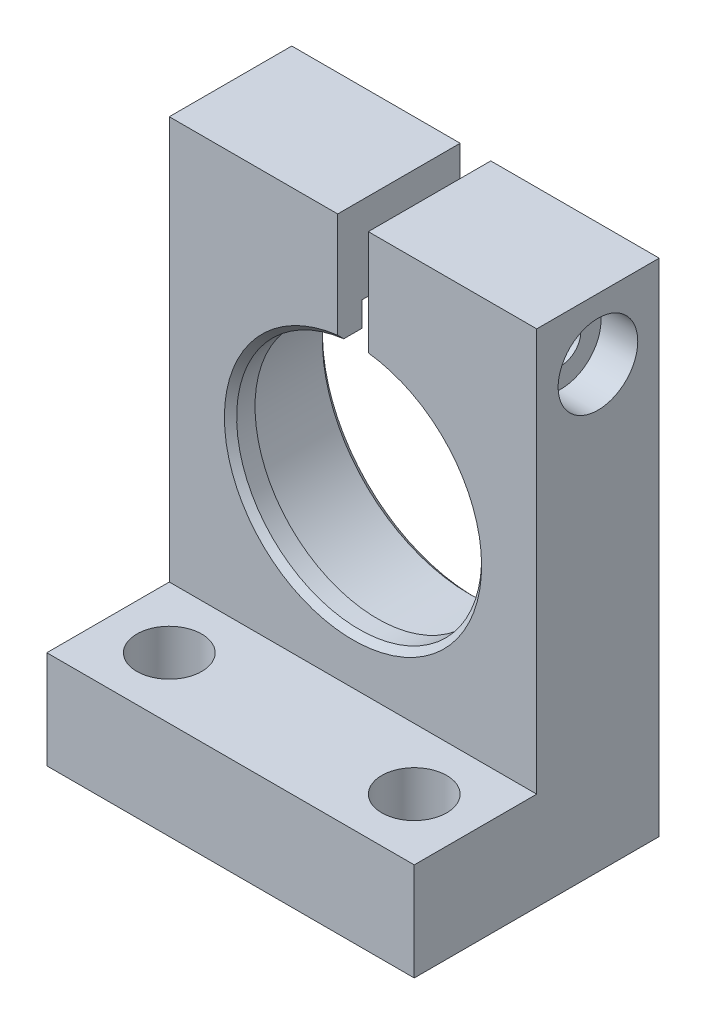
ISO-10303-21;
HEADER;
FILE_DESCRIPTION(('STEP AP214'),'2;1');
FILE_NAME('part.step','',(''),(''),'','','');
FILE_SCHEMA(('AUTOMOTIVE_DESIGN { 1 0 10303 214 1 1 1 1 }'));
ENDSEC;
DATA;
#1=APPLICATION_CONTEXT('core data for automotive mechanical design processes');
#2=APPLICATION_PROTOCOL_DEFINITION('international standard','automotive_design',2000,#1);
#3=PRODUCT_CONTEXT('',#1,'mechanical');
#4=PRODUCT('Part','Part','',(#3));
#5=PRODUCT_RELATED_PRODUCT_CATEGORY('part','',(#4));
#6=PRODUCT_DEFINITION_FORMATION('','',#4);
#7=PRODUCT_DEFINITION_CONTEXT('part definition',#1,'design');
#8=PRODUCT_DEFINITION('design','',#6,#7);
#9=PRODUCT_DEFINITION_SHAPE('','',#8);
#10=(LENGTH_UNIT() NAMED_UNIT(*) SI_UNIT(.MILLI.,.METRE.));
#11=(NAMED_UNIT(*) PLANE_ANGLE_UNIT() SI_UNIT($,.RADIAN.));
#12=(NAMED_UNIT(*) SI_UNIT($,.STERADIAN.) SOLID_ANGLE_UNIT());
#13=UNCERTAINTY_MEASURE_WITH_UNIT(LENGTH_MEASURE(1.E-05),#10,'distance_accuracy_value','');
#14=(GEOMETRIC_REPRESENTATION_CONTEXT(3) GLOBAL_UNCERTAINTY_ASSIGNED_CONTEXT((#13)) GLOBAL_UNIT_ASSIGNED_CONTEXT((#10,
#11,#12)) REPRESENTATION_CONTEXT('',''));
#15=CARTESIAN_POINT('',(0.,0.,0.));
#16=DIRECTION('',(0.,0.,1.));
#17=DIRECTION('',(1.,0.,0.));
#18=AXIS2_PLACEMENT_3D('',#15,#16,#17);
#19=CARTESIAN_POINT('',(0.,0.,10.));
#20=DIRECTION('',(0.,0.,1.));
#21=DIRECTION('',(1.,0.,0.));
#22=AXIS2_PLACEMENT_3D('',#19,#20,#21);
#23=PLANE('',#22);
#24=DIRECTION('',(0.,-1.,0.));
#25=VECTOR('',#24,1.);
#26=CARTESIAN_POINT('',(-15.,-21.9,10.));
#27=LINE('',#26,#25);
#28=CARTESIAN_POINT('',(-15.,19.,10.));
#29=VERTEX_POINT('',#28);
#30=CARTESIAN_POINT('',(-15.,-13.9,10.));
#31=VERTEX_POINT('',#30);
#32=EDGE_CURVE('E158',#29,#31,#27,.T.);
#33=ORIENTED_EDGE('',*,*,#32,.T.);
#34=DIRECTION('',(1.,0.,0.));
#35=VECTOR('',#34,1.);
#36=CARTESIAN_POINT('',(-15.,-13.9,10.));
#37=LINE('',#36,#35);
#38=CARTESIAN_POINT('',(15.,-13.9,10.));
#39=VERTEX_POINT('',#38);
#40=EDGE_CURVE('E143',#31,#39,#37,.T.);
#41=ORIENTED_EDGE('',*,*,#40,.T.);
#42=DIRECTION('',(0.,1.,0.));
#43=VECTOR('',#42,1.);
#44=CARTESIAN_POINT('',(15.,-21.9,10.));
#45=LINE('',#44,#43);
#46=CARTESIAN_POINT('',(15.,19.,10.));
#47=VERTEX_POINT('',#46);
#48=EDGE_CURVE('E169',#39,#47,#45,.T.);
#49=ORIENTED_EDGE('',*,*,#48,.T.);
#50=DIRECTION('',(-1.,0.,0.));
#51=VECTOR('',#50,1.);
#52=CARTESIAN_POINT('',(15.,19.,10.));
#53=LINE('',#52,#51);
#54=CARTESIAN_POINT('',(1.25,19.,10.));
#55=VERTEX_POINT('',#54);
#56=EDGE_CURVE('E182',#47,#55,#53,.T.);
#57=ORIENTED_EDGE('',*,*,#56,.T.);
#58=DIRECTION('',(0.,1.,0.));
#59=VECTOR('',#58,1.);
#60=CARTESIAN_POINT('',(1.25,9.92156741649221,10.));
#61=LINE('',#60,#59);
#62=CARTESIAN_POINT('',(1.25,10.4253297309965,10.));
#63=VERTEX_POINT('',#62);
#64=EDGE_CURVE('E341',#63,#55,#61,.T.);
#65=ORIENTED_EDGE('',*,*,#64,.F.);
#66=CARTESIAN_POINT('',(0.,0.,10.));
#67=DIRECTION('',(0.,0.,1.));
#68=DIRECTION('',(1.,0.,0.));
#69=AXIS2_PLACEMENT_3D('',#66,#67,#68);
#70=CIRCLE('',#69,10.5);
#71=CARTESIAN_POINT('',(-1.25,10.4253297309965,10.));
#72=VERTEX_POINT('',#71);
#73=EDGE_CURVE('E52',#63,#72,#70,.F.);
#74=ORIENTED_EDGE('',*,*,#73,.T.);
#75=DIRECTION('',(0.,-1.,0.));
#76=VECTOR('',#75,1.);
#77=CARTESIAN_POINT('',(-1.25,9.92156741649221,10.));
#78=LINE('',#77,#76);
#79=CARTESIAN_POINT('',(-1.25,19.,10.));
#80=VERTEX_POINT('',#79);
#81=EDGE_CURVE('E345',#80,#72,#78,.T.);
#82=ORIENTED_EDGE('',*,*,#81,.F.);
#83=EDGE_CURVE('E166',#80,#29,#53,.T.);
#84=ORIENTED_EDGE('',*,*,#83,.T.);
#85=EDGE_LOOP('',(#33,#41,#49,#57,#65,#74,#82,#84));
#86=FACE_BOUND('',#85,.T.);
#87=ADVANCED_FACE('F41',(#86),#23,.T.);
#88=CARTESIAN_POINT('',(15.,-21.9,10.));
#89=DIRECTION('',(-1.,0.,0.));
#90=DIRECTION('',(0.,0.,1.));
#91=AXIS2_PLACEMENT_3D('',#88,#89,#90);
#92=PLANE('',#91);
#93=DIRECTION('',(0.,1.,0.));
#94=VECTOR('',#93,1.);
#95=CARTESIAN_POINT('',(15.,-21.9,0.));
#96=LINE('',#95,#94);
#97=CARTESIAN_POINT('',(15.,-21.9,0.));
#98=VERTEX_POINT('',#97);
#99=CARTESIAN_POINT('',(15.,19.,0.));
#100=VERTEX_POINT('',#99);
#101=EDGE_CURVE('E193',#98,#100,#96,.T.);
#102=ORIENTED_EDGE('',*,*,#101,.T.);
#103=DIRECTION('',(0.,0.,-1.));
#104=VECTOR('',#103,1.);
#105=CARTESIAN_POINT('',(15.,19.,10.));
#106=LINE('',#105,#104);
#107=EDGE_CURVE('E198',#47,#100,#106,.T.);
#108=ORIENTED_EDGE('',*,*,#107,.F.);
#109=ORIENTED_EDGE('',*,*,#48,.F.);
#110=DIRECTION('',(0.,0.,1.));
#111=VECTOR('',#110,1.);
#112=CARTESIAN_POINT('',(15.,-13.9,10.));
#113=LINE('',#112,#111);
#114=CARTESIAN_POINT('',(15.,-13.9,20.));
#115=VERTEX_POINT('',#114);
#116=EDGE_CURVE('E59',#39,#115,#113,.T.);
#117=ORIENTED_EDGE('',*,*,#116,.T.);
#118=DIRECTION('',(0.,-1.,0.));
#119=VECTOR('',#118,1.);
#120=CARTESIAN_POINT('',(15.,-13.9,20.));
#121=LINE('',#120,#119);
#122=CARTESIAN_POINT('',(15.,-21.9,20.));
#123=VERTEX_POINT('',#122);
#124=EDGE_CURVE('E377',#115,#123,#121,.T.);
#125=ORIENTED_EDGE('',*,*,#124,.T.);
#126=DIRECTION('',(0.,0.,-1.));
#127=VECTOR('',#126,1.);
#128=CARTESIAN_POINT('',(15.,-21.9,10.));
#129=LINE('',#128,#127);
#130=EDGE_CURVE('E202',#123,#98,#129,.T.);
#131=ORIENTED_EDGE('',*,*,#130,.T.);
#132=EDGE_LOOP('',(#102,#108,#109,#117,#125,#131));
#133=FACE_BOUND('',#132,.T.);
#134=CARTESIAN_POINT('',(15.,14.,5.));
#135=DIRECTION('',(1.,0.,0.));
#136=DIRECTION('',(0.,0.,-1.));
#137=AXIS2_PLACEMENT_3D('',#134,#135,#136);
#138=CIRCLE('',#137,3.25);
#139=CARTESIAN_POINT('',(15.,14.,1.75));
#140=VERTEX_POINT('',#139);
#141=EDGE_CURVE('E365',#140,#140,#138,.T.);
#142=ORIENTED_EDGE('',*,*,#141,.F.);
#143=EDGE_LOOP('',(#142));
#144=FACE_BOUND('',#143,.T.);
#145=ADVANCED_FACE('F287',(#133,#144),#92,.F.);
#146=CARTESIAN_POINT('',(15.,19.,10.));
#147=DIRECTION('',(0.,-1.,0.));
#148=DIRECTION('',(1.,0.,0.));
#149=AXIS2_PLACEMENT_3D('',#146,#147,#148);
#150=PLANE('',#149);
#151=ORIENTED_EDGE('',*,*,#83,.F.);
#152=DIRECTION('',(0.,0.,1.));
#153=VECTOR('',#152,1.);
#154=CARTESIAN_POINT('',(-1.25,19.,0.));
#155=LINE('',#154,#153);
#156=CARTESIAN_POINT('',(-1.25,19.,0.));
#157=VERTEX_POINT('',#156);
#158=EDGE_CURVE('E333',#157,#80,#155,.T.);
#159=ORIENTED_EDGE('',*,*,#158,.F.);
#160=DIRECTION('',(-1.,0.,0.));
#161=VECTOR('',#160,1.);
#162=CARTESIAN_POINT('',(15.,19.,0.));
#163=LINE('',#162,#161);
#164=CARTESIAN_POINT('',(-15.,19.,0.));
#165=VERTEX_POINT('',#164);
#166=EDGE_CURVE('E176',#157,#165,#163,.T.);
#167=ORIENTED_EDGE('',*,*,#166,.T.);
#168=DIRECTION('',(0.,0.,-1.));
#169=VECTOR('',#168,1.);
#170=CARTESIAN_POINT('',(-15.,19.,10.));
#171=LINE('',#170,#169);
#172=EDGE_CURVE('E186',#29,#165,#171,.T.);
#173=ORIENTED_EDGE('',*,*,#172,.F.);
#174=EDGE_LOOP('',(#151,#159,#167,#173));
#175=FACE_BOUND('',#174,.T.);
#176=ADVANCED_FACE('F290',(#175),#150,.F.);
#177=CARTESIAN_POINT('',(0.,0.,0.));
#178=DIRECTION('',(0.,0.,1.));
#179=DIRECTION('',(1.,0.,0.));
#180=AXIS2_PLACEMENT_3D('',#177,#178,#179);
#181=PLANE('',#180);
#182=DIRECTION('',(0.,-1.,0.));
#183=VECTOR('',#182,1.);
#184=CARTESIAN_POINT('',(-1.25,9.92156741649221,0.));
#185=LINE('',#184,#183);
#186=CARTESIAN_POINT('',(-1.25,12.4373429638328,0.));
#187=VERTEX_POINT('',#186);
#188=EDGE_CURVE('E344',#157,#187,#185,.T.);
#189=ORIENTED_EDGE('',*,*,#188,.T.);
#190=CARTESIAN_POINT('',(0.,0.,0.));
#191=DIRECTION('',(0.,0.,1.));
#192=DIRECTION('',(1.,0.,0.));
#193=AXIS2_PLACEMENT_3D('',#190,#191,#192);
#194=CIRCLE('',#193,12.5);
#195=CARTESIAN_POINT('',(1.25,12.4373429638328,0.));
#196=VERTEX_POINT('',#195);
#197=EDGE_CURVE('E221',#187,#196,#194,.T.);
#198=ORIENTED_EDGE('',*,*,#197,.T.);
#199=DIRECTION('',(0.,1.,0.));
#200=VECTOR('',#199,1.);
#201=CARTESIAN_POINT('',(1.25,9.92156741649221,0.));
#202=LINE('',#201,#200);
#203=CARTESIAN_POINT('',(1.25,19.,0.));
#204=VERTEX_POINT('',#203);
#205=EDGE_CURVE('E338',#196,#204,#202,.T.);
#206=ORIENTED_EDGE('',*,*,#205,.T.);
#207=EDGE_CURVE('E170',#100,#204,#163,.T.);
#208=ORIENTED_EDGE('',*,*,#207,.F.);
#209=ORIENTED_EDGE('',*,*,#101,.F.);
#210=DIRECTION('',(1.,0.,0.));
#211=VECTOR('',#210,1.);
#212=CARTESIAN_POINT('',(15.,-21.9,0.));
#213=LINE('',#212,#211);
#214=CARTESIAN_POINT('',(-15.,-21.9,0.));
#215=VERTEX_POINT('',#214);
#216=EDGE_CURVE('E190',#215,#98,#213,.T.);
#217=ORIENTED_EDGE('',*,*,#216,.F.);
#218=DIRECTION('',(0.,-1.,0.));
#219=VECTOR('',#218,1.);
#220=CARTESIAN_POINT('',(-15.,-21.9,0.));
#221=LINE('',#220,#219);
#222=EDGE_CURVE('E187',#165,#215,#221,.T.);
#223=ORIENTED_EDGE('',*,*,#222,.F.);
#224=ORIENTED_EDGE('',*,*,#166,.F.);
#225=EDGE_LOOP('',(#189,#198,#206,#208,#209,#217,#223,#224));
#226=FACE_BOUND('',#225,.T.);
#227=ADVANCED_FACE('F281',(#226),#181,.F.);
#228=CARTESIAN_POINT('',(-15.,-21.9,10.));
#229=DIRECTION('',(1.,0.,0.));
#230=DIRECTION('',(0.,0.,-1.));
#231=AXIS2_PLACEMENT_3D('',#228,#229,#230);
#232=PLANE('',#231);
#233=CARTESIAN_POINT('',(-15.,14.,5.));
#234=DIRECTION('',(-1.,0.,0.));
#235=DIRECTION('',(0.,0.,1.));
#236=AXIS2_PLACEMENT_3D('',#233,#234,#235);
#237=CIRCLE('',#236,1.25);
#238=CARTESIAN_POINT('',(-15.,14.,6.25));
#239=VERTEX_POINT('',#238);
#240=EDGE_CURVE('E373',#239,#239,#237,.T.);
#241=ORIENTED_EDGE('',*,*,#240,.F.);
#242=EDGE_LOOP('',(#241));
#243=FACE_BOUND('',#242,.T.);
#244=ORIENTED_EDGE('',*,*,#222,.T.);
#245=DIRECTION('',(0.,0.,-1.));
#246=VECTOR('',#245,1.);
#247=CARTESIAN_POINT('',(-15.,-21.9,10.));
#248=LINE('',#247,#246);
#249=CARTESIAN_POINT('',(-15.,-21.9,20.));
#250=VERTEX_POINT('',#249);
#251=EDGE_CURVE('E206',#250,#215,#248,.T.);
#252=ORIENTED_EDGE('',*,*,#251,.F.);
#253=DIRECTION('',(0.,-1.,0.));
#254=VECTOR('',#253,1.);
#255=CARTESIAN_POINT('',(-15.,-13.9,20.));
#256=LINE('',#255,#254);
#257=CARTESIAN_POINT('',(-15.,-13.9,20.));
#258=VERTEX_POINT('',#257);
#259=EDGE_CURVE('E160',#258,#250,#256,.T.);
#260=ORIENTED_EDGE('',*,*,#259,.F.);
#261=DIRECTION('',(0.,0.,-1.));
#262=VECTOR('',#261,1.);
#263=CARTESIAN_POINT('',(-15.,-13.9,10.));
#264=LINE('',#263,#262);
#265=EDGE_CURVE('E146',#258,#31,#264,.T.);
#266=ORIENTED_EDGE('',*,*,#265,.T.);
#267=ORIENTED_EDGE('',*,*,#32,.F.);
#268=ORIENTED_EDGE('',*,*,#172,.T.);
#269=EDGE_LOOP('',(#244,#252,#260,#266,#267,#268));
#270=FACE_BOUND('',#269,.T.);
#271=ADVANCED_FACE('F156',(#243,#270),#232,.F.);
#272=CARTESIAN_POINT('',(15.,-21.9,10.));
#273=DIRECTION('',(0.,1.,0.));
#274=DIRECTION('',(-1.,0.,0.));
#275=AXIS2_PLACEMENT_3D('',#272,#273,#274);
#276=PLANE('',#275);
#277=CARTESIAN_POINT('',(-10.,-21.9,15.));
#278=DIRECTION('',(0.,1.,0.));
#279=DIRECTION('',(-1.,0.,0.));
#280=AXIS2_PLACEMENT_3D('',#277,#278,#279);
#281=CIRCLE('',#280,2.65);
#282=CARTESIAN_POINT('',(-12.65,-21.9,15.));
#283=VERTEX_POINT('',#282);
#284=EDGE_CURVE('E399',#283,#283,#281,.T.);
#285=ORIENTED_EDGE('',*,*,#284,.T.);
#286=EDGE_LOOP('',(#285));
#287=FACE_BOUND('',#286,.T.);
#288=CARTESIAN_POINT('',(10.,-21.9,15.));
#289=DIRECTION('',(0.,1.,0.));
#290=DIRECTION('',(-1.,0.,0.));
#291=AXIS2_PLACEMENT_3D('',#288,#289,#290);
#292=CIRCLE('',#291,2.65);
#293=CARTESIAN_POINT('',(7.35,-21.9,15.));
#294=VERTEX_POINT('',#293);
#295=EDGE_CURVE('E387',#294,#294,#292,.T.);
#296=ORIENTED_EDGE('',*,*,#295,.T.);
#297=EDGE_LOOP('',(#296));
#298=FACE_BOUND('',#297,.T.);
#299=ORIENTED_EDGE('',*,*,#216,.T.);
#300=ORIENTED_EDGE('',*,*,#130,.F.);
#301=DIRECTION('',(-1.,0.,0.));
#302=VECTOR('',#301,1.);
#303=CARTESIAN_POINT('',(-15.,-21.9,20.));
#304=LINE('',#303,#302);
#305=EDGE_CURVE('E162',#123,#250,#304,.T.);
#306=ORIENTED_EDGE('',*,*,#305,.T.);
#307=ORIENTED_EDGE('',*,*,#251,.T.);
#308=EDGE_LOOP('',(#299,#300,#306,#307));
#309=FACE_BOUND('',#308,.T.);
#310=ADVANCED_FACE('F280',(#287,#298,#309),#276,.F.);
#311=ORIENTED_EDGE('',*,*,#207,.T.);
#312=DIRECTION('',(0.,0.,1.));
#313=VECTOR('',#312,1.);
#314=CARTESIAN_POINT('',(1.25,19.,0.));
#315=LINE('',#314,#313);
#316=EDGE_CURVE('E334',#204,#55,#315,.T.);
#317=ORIENTED_EDGE('',*,*,#316,.T.);
#318=ORIENTED_EDGE('',*,*,#56,.F.);
#319=ORIENTED_EDGE('',*,*,#107,.T.);
#320=EDGE_LOOP('',(#311,#317,#318,#319));
#321=FACE_BOUND('',#320,.T.);
#322=ADVANCED_FACE('F285',(#321),#150,.F.);
#323=CARTESIAN_POINT('',(0.,0.,10.));
#324=DIRECTION('',(0.,0.,-1.));
#325=DIRECTION('',(-1.,0.,0.));
#326=AXIS2_PLACEMENT_3D('',#323,#324,#325);
#327=CYLINDRICAL_SURFACE('',#326,12.);
#328=DIRECTION('',(0.,0.,-1.));
#329=VECTOR('',#328,1.);
#330=CARTESIAN_POINT('',(1.25,11.93471826228,10.));
#331=LINE('',#330,#329);
#332=CARTESIAN_POINT('',(1.25,11.93471826228,0.500000000000002));
#333=VERTEX_POINT('',#332);
#334=CARTESIAN_POINT('',(1.25,11.93471826228,8.));
#335=VERTEX_POINT('',#334);
#336=EDGE_CURVE('E320',#333,#335,#331,.F.);
#337=ORIENTED_EDGE('',*,*,#336,.F.);
#338=CARTESIAN_POINT('',(0.,0.,0.500000000000002));
#339=DIRECTION('',(0.,0.,1.));
#340=DIRECTION('',(1.,0.,0.));
#341=AXIS2_PLACEMENT_3D('',#338,#339,#340);
#342=CIRCLE('',#341,12.);
#343=CARTESIAN_POINT('',(-1.25,11.93471826228,0.500000000000002));
#344=VERTEX_POINT('',#343);
#345=EDGE_CURVE('E462',#333,#344,#342,.F.);
#346=ORIENTED_EDGE('',*,*,#345,.T.);
#347=DIRECTION('',(0.,0.,-1.));
#348=VECTOR('',#347,1.);
#349=CARTESIAN_POINT('',(-1.25,11.93471826228,10.));
#350=LINE('',#349,#348);
#351=CARTESIAN_POINT('',(-1.25,11.93471826228,8.));
#352=VERTEX_POINT('',#351);
#353=EDGE_CURVE('E319',#352,#344,#350,.T.);
#354=ORIENTED_EDGE('',*,*,#353,.F.);
#355=CARTESIAN_POINT('',(0.,0.,8.));
#356=DIRECTION('',(0.,0.,-1.));
#357=DIRECTION('',(-1.,0.,0.));
#358=AXIS2_PLACEMENT_3D('',#355,#356,#357);
#359=CIRCLE('',#358,12.);
#360=EDGE_CURVE('E210',#335,#352,#359,.T.);
#361=ORIENTED_EDGE('',*,*,#360,.F.);
#362=EDGE_LOOP('',(#337,#346,#354,#361));
#363=FACE_BOUND('',#362,.T.);
#364=ADVANCED_FACE('F294',(#363),#327,.F.);
#365=CARTESIAN_POINT('',(0.,0.,8.));
#366=DIRECTION('',(0.,0.,-1.));
#367=DIRECTION('',(-1.,0.,0.));
#368=AXIS2_PLACEMENT_3D('',#365,#366,#367);
#369=PLANE('',#368);
#370=DIRECTION('',(0.,1.,0.));
#371=VECTOR('',#370,1.);
#372=CARTESIAN_POINT('',(-1.25,0.,8.));
#373=LINE('',#372,#371);
#374=CARTESIAN_POINT('',(-1.25,9.92156741649221,8.));
#375=VERTEX_POINT('',#374);
#376=EDGE_CURVE('E312',#375,#352,#373,.T.);
#377=ORIENTED_EDGE('',*,*,#376,.F.);
#378=CARTESIAN_POINT('',(0.,0.,8.));
#379=DIRECTION('',(0.,0.,-1.));
#380=DIRECTION('',(-1.,0.,0.));
#381=AXIS2_PLACEMENT_3D('',#378,#379,#380);
#382=CIRCLE('',#381,10.);
#383=CARTESIAN_POINT('',(1.25,9.92156741649221,8.));
#384=VERTEX_POINT('',#383);
#385=EDGE_CURVE('E179',#384,#375,#382,.T.);
#386=ORIENTED_EDGE('',*,*,#385,.F.);
#387=DIRECTION('',(0.,-1.,0.));
#388=VECTOR('',#387,1.);
#389=CARTESIAN_POINT('',(1.25,0.,8.));
#390=LINE('',#389,#388);
#391=EDGE_CURVE('E330',#335,#384,#390,.T.);
#392=ORIENTED_EDGE('',*,*,#391,.F.);
#393=ORIENTED_EDGE('',*,*,#360,.T.);
#394=EDGE_LOOP('',(#377,#386,#392,#393));
#395=FACE_BOUND('',#394,.T.);
#396=ADVANCED_FACE('F302',(#395),#369,.T.);
#397=CARTESIAN_POINT('',(0.,0.,8.));
#398=DIRECTION('',(0.,0.,1.));
#399=DIRECTION('',(1.,0.,0.));
#400=AXIS2_PLACEMENT_3D('',#397,#398,#399);
#401=CYLINDRICAL_SURFACE('',#400,10.);
#402=DIRECTION('',(0.,0.,1.));
#403=VECTOR('',#402,1.);
#404=CARTESIAN_POINT('',(-1.25,9.92156741649221,8.));
#405=LINE('',#404,#403);
#406=CARTESIAN_POINT('',(-1.25,9.92156741649221,9.50000000000001));
#407=VERTEX_POINT('',#406);
#408=EDGE_CURVE('E214',#407,#375,#405,.F.);
#409=ORIENTED_EDGE('',*,*,#408,.F.);
#410=CARTESIAN_POINT('',(0.,0.,9.50000000000001));
#411=DIRECTION('',(0.,0.,1.));
#412=DIRECTION('',(1.,0.,0.));
#413=AXIS2_PLACEMENT_3D('',#410,#411,#412);
#414=CIRCLE('',#413,10.);
#415=CARTESIAN_POINT('',(1.25,9.92156741649221,9.50000000000001));
#416=VERTEX_POINT('',#415);
#417=EDGE_CURVE('E11',#407,#416,#414,.T.);
#418=ORIENTED_EDGE('',*,*,#417,.T.);
#419=DIRECTION('',(0.,0.,1.));
#420=VECTOR('',#419,1.);
#421=CARTESIAN_POINT('',(1.25,9.92156741649221,8.));
#422=LINE('',#421,#420);
#423=EDGE_CURVE('E217',#384,#416,#422,.T.);
#424=ORIENTED_EDGE('',*,*,#423,.F.);
#425=ORIENTED_EDGE('',*,*,#385,.T.);
#426=EDGE_LOOP('',(#409,#418,#424,#425));
#427=FACE_BOUND('',#426,.T.);
#428=ADVANCED_FACE('F252',(#427),#401,.F.);
#429=CARTESIAN_POINT('',(-1.25,9.92156741649221,0.));
#430=DIRECTION('',(-1.,0.,0.));
#431=DIRECTION('',(0.,-1.,0.));
#432=AXIS2_PLACEMENT_3D('',#429,#430,#431);
#433=PLANE('',#432);
#434=CARTESIAN_POINT('',(-1.25,14.,5.));
#435=DIRECTION('',(-1.,0.,0.));
#436=DIRECTION('',(0.,-1.,0.));
#437=AXIS2_PLACEMENT_3D('',#434,#435,#436);
#438=CIRCLE('',#437,1.25);
#439=CARTESIAN_POINT('',(-1.25,12.75,5.));
#440=VERTEX_POINT('',#439);
#441=EDGE_CURVE('E369',#440,#440,#438,.T.);
#442=ORIENTED_EDGE('',*,*,#441,.T.);
#443=EDGE_LOOP('',(#442));
#444=FACE_BOUND('',#443,.T.);
#445=ORIENTED_EDGE('',*,*,#353,.T.);
#446=CARTESIAN_POINT('',(-1.25,11.93471826228,0.500000000000002));
#447=CARTESIAN_POINT('',(-1.25,12.0184979967429,0.416675664514309));
#448=CARTESIAN_POINT('',(-1.25,12.1022732557729,0.333346830102343));
#449=CARTESIAN_POINT('',(-1.25,12.2698148229571,0.166680163435674));
#450=CARTESIAN_POINT('',(-1.25,12.3535811311114,0.083342331180973));
#451=CARTESIAN_POINT('',(-1.25,12.4373429638328,0.));
#452=B_SPLINE_CURVE_WITH_KNOTS('',3,(#446,#447,#448,#449,#450,#451),.UNSPECIFIED.,.F.,.F.,(4,2,
4),(0.,0.354482577893423,0.708965155745116),.UNSPECIFIED.);
#453=EDGE_CURVE('E262',#344,#187,#452,.T.);
#454=ORIENTED_EDGE('',*,*,#453,.T.);
#455=ORIENTED_EDGE('',*,*,#188,.F.);
#456=ORIENTED_EDGE('',*,*,#158,.T.);
#457=ORIENTED_EDGE('',*,*,#81,.T.);
#458=CARTESIAN_POINT('',(-1.25,10.4253297309965,10.));
#459=CARTESIAN_POINT('',(-1.25,10.3413846963342,9.91665120010179));
#460=CARTESIAN_POINT('',(-1.25,10.2574319861363,9.83331013349464));
#461=CARTESIAN_POINT('',(-1.25,10.0895112146349,9.66664346682797));
#462=CARTESIAN_POINT('',(-1.25,10.0055431533313,9.58331786676846));
#463=CARTESIAN_POINT('',(-1.25,9.92156741649221,9.50000000000001));
#464=B_SPLINE_CURVE_WITH_KNOTS('',3,(#458,#459,#460,#461,#462,#463),.UNSPECIFIED.,.F.,.F.,(4,2,
4),(0.,0.354886063962817,0.709772128072496),.UNSPECIFIED.);
#465=EDGE_CURVE('E67',#72,#407,#464,.T.);
#466=ORIENTED_EDGE('',*,*,#465,.T.);
#467=ORIENTED_EDGE('',*,*,#408,.T.);
#468=ORIENTED_EDGE('',*,*,#376,.T.);
#469=EDGE_LOOP('',(#445,#454,#455,#456,#457,#466,#467,#468));
#470=FACE_BOUND('',#469,.T.);
#471=ADVANCED_FACE('F245',(#444,#470),#433,.F.);
#472=CARTESIAN_POINT('',(1.25,9.92156741649221,0.));
#473=DIRECTION('',(1.,0.,0.));
#474=DIRECTION('',(0.,1.,0.));
#475=AXIS2_PLACEMENT_3D('',#472,#473,#474);
#476=PLANE('',#475);
#477=CARTESIAN_POINT('',(1.25,14.,5.));
#478=DIRECTION('',(1.,0.,0.));
#479=DIRECTION('',(0.,1.,0.));
#480=AXIS2_PLACEMENT_3D('',#477,#478,#479);
#481=CIRCLE('',#480,1.6);
#482=CARTESIAN_POINT('',(1.25,15.6,5.));
#483=VERTEX_POINT('',#482);
#484=EDGE_CURVE('E348',#483,#483,#481,.T.);
#485=ORIENTED_EDGE('',*,*,#484,.T.);
#486=EDGE_LOOP('',(#485));
#487=FACE_BOUND('',#486,.T.);
#488=ORIENTED_EDGE('',*,*,#205,.F.);
#489=CARTESIAN_POINT('',(1.25,12.4373429638328,0.));
#490=CARTESIAN_POINT('',(1.25,12.3535811311114,0.0833423311809731));
#491=CARTESIAN_POINT('',(1.25,12.2698148229571,0.166680163435674));
#492=CARTESIAN_POINT('',(1.25,12.1022732557729,0.333346830102342));
#493=CARTESIAN_POINT('',(1.25,12.0184979967429,0.416675664514308));
#494=CARTESIAN_POINT('',(1.25,11.93471826228,0.500000000000001));
#495=B_SPLINE_CURVE_WITH_KNOTS('',3,(#489,#490,#491,#492,#493,#494),.UNSPECIFIED.,.F.,.F.,(4,2,
4),(0.,0.354482577851693,0.708965155745116),.UNSPECIFIED.);
#496=EDGE_CURVE('E233',#196,#333,#495,.T.);
#497=ORIENTED_EDGE('',*,*,#496,.T.);
#498=ORIENTED_EDGE('',*,*,#336,.T.);
#499=ORIENTED_EDGE('',*,*,#391,.T.);
#500=ORIENTED_EDGE('',*,*,#423,.T.);
#501=CARTESIAN_POINT('',(1.25,9.92156741649221,9.50000000000001));
#502=CARTESIAN_POINT('',(1.25,10.0055431533313,9.58331786676846));
#503=CARTESIAN_POINT('',(1.25,10.0895112146349,9.66664346682797));
#504=CARTESIAN_POINT('',(1.25,10.2574319861363,9.83331013349464));
#505=CARTESIAN_POINT('',(1.25,10.3413846963342,9.91665120010179));
#506=CARTESIAN_POINT('',(1.25,10.4253297309965,10.));
#507=B_SPLINE_CURVE_WITH_KNOTS('',3,(#501,#502,#503,#504,#505,#506),.UNSPECIFIED.,.F.,.F.,(4,2,
4),(0.,0.35488606410968,0.709772128072496),.UNSPECIFIED.);
#508=EDGE_CURVE('E225',#416,#63,#507,.T.);
#509=ORIENTED_EDGE('',*,*,#508,.T.);
#510=ORIENTED_EDGE('',*,*,#64,.T.);
#511=ORIENTED_EDGE('',*,*,#316,.F.);
#512=EDGE_LOOP('',(#488,#497,#498,#499,#500,#509,#510,#511));
#513=FACE_BOUND('',#512,.T.);
#514=ADVANCED_FACE('F239',(#487,#513),#476,.F.);
#515=CARTESIAN_POINT('',(15.,14.,5.));
#516=DIRECTION('',(1.,0.,0.));
#517=DIRECTION('',(0.,0.,-1.));
#518=AXIS2_PLACEMENT_3D('',#515,#516,#517);
#519=CYLINDRICAL_SURFACE('',#518,1.6);
#520=ORIENTED_EDGE('',*,*,#484,.F.);
#521=EDGE_LOOP('',(#520));
#522=FACE_BOUND('',#521,.T.);
#523=CARTESIAN_POINT('',(12.,14.,5.));
#524=DIRECTION('',(1.,0.,0.));
#525=DIRECTION('',(0.,0.,-1.));
#526=AXIS2_PLACEMENT_3D('',#523,#524,#525);
#527=CIRCLE('',#526,1.6);
#528=CARTESIAN_POINT('',(12.,14.,3.4));
#529=VERTEX_POINT('',#528);
#530=EDGE_CURVE('E357',#529,#529,#527,.T.);
#531=ORIENTED_EDGE('',*,*,#530,.T.);
#532=EDGE_LOOP('',(#531));
#533=FACE_BOUND('',#532,.T.);
#534=ADVANCED_FACE('F244',(#522,#533),#519,.F.);
#535=CARTESIAN_POINT('',(12.,15.6,5.));
#536=DIRECTION('',(-1.,0.,0.));
#537=DIRECTION('',(0.,0.,1.));
#538=AXIS2_PLACEMENT_3D('',#535,#536,#537);
#539=PLANE('',#538);
#540=ORIENTED_EDGE('',*,*,#530,.F.);
#541=EDGE_LOOP('',(#540));
#542=FACE_BOUND('',#541,.T.);
#543=CARTESIAN_POINT('',(12.,14.,5.));
#544=DIRECTION('',(1.,0.,0.));
#545=DIRECTION('',(0.,0.,-1.));
#546=AXIS2_PLACEMENT_3D('',#543,#544,#545);
#547=CIRCLE('',#546,3.25);
#548=CARTESIAN_POINT('',(12.,14.,1.75));
#549=VERTEX_POINT('',#548);
#550=EDGE_CURVE('E361',#549,#549,#547,.T.);
#551=ORIENTED_EDGE('',*,*,#550,.T.);
#552=EDGE_LOOP('',(#551));
#553=FACE_BOUND('',#552,.T.);
#554=ADVANCED_FACE('F435',(#542,#553),#539,.F.);
#555=CARTESIAN_POINT('',(15.,14.,5.));
#556=DIRECTION('',(1.,0.,0.));
#557=DIRECTION('',(0.,0.,-1.));
#558=AXIS2_PLACEMENT_3D('',#555,#556,#557);
#559=CYLINDRICAL_SURFACE('',#558,3.25);
#560=ORIENTED_EDGE('',*,*,#550,.F.);
#561=EDGE_LOOP('',(#560));
#562=FACE_BOUND('',#561,.T.);
#563=ORIENTED_EDGE('',*,*,#141,.T.);
#564=EDGE_LOOP('',(#563));
#565=FACE_BOUND('',#564,.T.);
#566=ADVANCED_FACE('F432',(#562,#565),#559,.F.);
#567=CARTESIAN_POINT('',(-15.,14.,5.));
#568=DIRECTION('',(-1.,0.,0.));
#569=DIRECTION('',(0.,0.,1.));
#570=AXIS2_PLACEMENT_3D('',#567,#568,#569);
#571=CYLINDRICAL_SURFACE('',#570,1.25);
#572=ORIENTED_EDGE('',*,*,#441,.F.);
#573=EDGE_LOOP('',(#572));
#574=FACE_BOUND('',#573,.T.);
#575=ORIENTED_EDGE('',*,*,#240,.T.);
#576=EDGE_LOOP('',(#575));
#577=FACE_BOUND('',#576,.T.);
#578=ADVANCED_FACE('F275',(#574,#577),#571,.F.);
#579=CARTESIAN_POINT('',(0.,0.,0.));
#580=DIRECTION('',(0.,0.,-1.));
#581=DIRECTION('',(-1.,0.,0.));
#582=AXIS2_PLACEMENT_3D('',#579,#580,#581);
#583=CONICAL_SURFACE('',#582,12.5,0.785398163397448);
#584=ORIENTED_EDGE('',*,*,#453,.F.);
#585=ORIENTED_EDGE('',*,*,#345,.F.);
#586=ORIENTED_EDGE('',*,*,#496,.F.);
#587=ORIENTED_EDGE('',*,*,#197,.F.);
#588=EDGE_LOOP('',(#584,#585,#586,#587));
#589=FACE_BOUND('',#588,.T.);
#590=ADVANCED_FACE('F269',(#589),#583,.F.);
#591=CARTESIAN_POINT('',(0.,0.,10.));
#592=DIRECTION('',(0.,0.,1.));
#593=DIRECTION('',(1.,0.,0.));
#594=AXIS2_PLACEMENT_3D('',#591,#592,#593);
#595=CONICAL_SURFACE('',#594,10.5,0.785398163397448);
#596=ORIENTED_EDGE('',*,*,#508,.F.);
#597=ORIENTED_EDGE('',*,*,#417,.F.);
#598=ORIENTED_EDGE('',*,*,#465,.F.);
#599=ORIENTED_EDGE('',*,*,#73,.F.);
#600=EDGE_LOOP('',(#596,#597,#598,#599));
#601=FACE_BOUND('',#600,.T.);
#602=ADVANCED_FACE('F44',(#601),#595,.F.);
#603=CARTESIAN_POINT('',(-15.,-13.9,20.));
#604=DIRECTION('',(0.,0.,1.));
#605=DIRECTION('',(1.,0.,0.));
#606=AXIS2_PLACEMENT_3D('',#603,#604,#605);
#607=PLANE('',#606);
#608=ORIENTED_EDGE('',*,*,#305,.F.);
#609=ORIENTED_EDGE('',*,*,#124,.F.);
#610=DIRECTION('',(-1.,0.,0.));
#611=VECTOR('',#610,1.);
#612=CARTESIAN_POINT('',(-15.,-13.9,20.));
#613=LINE('',#612,#611);
#614=EDGE_CURVE('E381',#115,#258,#613,.T.);
#615=ORIENTED_EDGE('',*,*,#614,.T.);
#616=ORIENTED_EDGE('',*,*,#259,.T.);
#617=EDGE_LOOP('',(#608,#609,#615,#616));
#618=FACE_BOUND('',#617,.T.);
#619=ADVANCED_FACE('F413',(#618),#607,.T.);
#620=CARTESIAN_POINT('',(0.,-13.9,0.));
#621=DIRECTION('',(0.,1.,0.));
#622=DIRECTION('',(-1.,0.,0.));
#623=AXIS2_PLACEMENT_3D('',#620,#621,#622);
#624=PLANE('',#623);
#625=CARTESIAN_POINT('',(-10.,-13.9,15.));
#626=DIRECTION('',(0.,1.,0.));
#627=DIRECTION('',(0.,0.,1.));
#628=AXIS2_PLACEMENT_3D('',#625,#626,#627);
#629=CIRCLE('',#628,2.65);
#630=CARTESIAN_POINT('',(-10.,-13.9,17.65));
#631=VERTEX_POINT('',#630);
#632=EDGE_CURVE('E403',#631,#631,#629,.T.);
#633=ORIENTED_EDGE('',*,*,#632,.F.);
#634=EDGE_LOOP('',(#633));
#635=FACE_BOUND('',#634,.T.);
#636=CARTESIAN_POINT('',(10.,-13.9,15.));
#637=DIRECTION('',(0.,1.,0.));
#638=DIRECTION('',(0.,0.,1.));
#639=AXIS2_PLACEMENT_3D('',#636,#637,#638);
#640=CIRCLE('',#639,2.65);
#641=CARTESIAN_POINT('',(10.,-13.9,17.65));
#642=VERTEX_POINT('',#641);
#643=EDGE_CURVE('E395',#642,#642,#640,.T.);
#644=ORIENTED_EDGE('',*,*,#643,.F.);
#645=EDGE_LOOP('',(#644));
#646=FACE_BOUND('',#645,.T.);
#647=ORIENTED_EDGE('',*,*,#265,.F.);
#648=ORIENTED_EDGE('',*,*,#614,.F.);
#649=ORIENTED_EDGE('',*,*,#116,.F.);
#650=ORIENTED_EDGE('',*,*,#40,.F.);
#651=EDGE_LOOP('',(#647,#648,#649,#650));
#652=FACE_BOUND('',#651,.T.);
#653=ADVANCED_FACE('F145',(#635,#646,#652),#624,.T.);
#654=CARTESIAN_POINT('',(10.,-13.9,15.));
#655=DIRECTION('',(0.,1.,0.));
#656=DIRECTION('',(0.,0.,1.));
#657=AXIS2_PLACEMENT_3D('',#654,#655,#656);
#658=CYLINDRICAL_SURFACE('',#657,2.65);
#659=ORIENTED_EDGE('',*,*,#295,.F.);
#660=EDGE_LOOP('',(#659));
#661=FACE_BOUND('',#660,.T.);
#662=ORIENTED_EDGE('',*,*,#643,.T.);
#663=EDGE_LOOP('',(#662));
#664=FACE_BOUND('',#663,.T.);
#665=ADVANCED_FACE('F412',(#661,#664),#658,.F.);
#666=CARTESIAN_POINT('',(-10.,-13.9,15.));
#667=DIRECTION('',(0.,1.,0.));
#668=DIRECTION('',(0.,0.,1.));
#669=AXIS2_PLACEMENT_3D('',#666,#667,#668);
#670=CYLINDRICAL_SURFACE('',#669,2.65);
#671=ORIENTED_EDGE('',*,*,#284,.F.);
#672=EDGE_LOOP('',(#671));
#673=FACE_BOUND('',#672,.T.);
#674=ORIENTED_EDGE('',*,*,#632,.T.);
#675=EDGE_LOOP('',(#674));
#676=FACE_BOUND('',#675,.T.);
#677=ADVANCED_FACE('F408',(#673,#676),#670,.F.);
#678=CLOSED_SHELL('',(#87,#145,#176,#227,#271,#310,#322,#364,#396,#428,#471,#514,#534,#554,#566,
#578,#590,#602,#619,#653,#665,#677));
#679=MANIFOLD_SOLID_BREP('B2',#678);
#680=ADVANCED_BREP_SHAPE_REPRESENTATION('',(#18,#679),#14);
#681=SHAPE_DEFINITION_REPRESENTATION(#9,#680);
ENDSEC;
END-ISO-10303-21;
